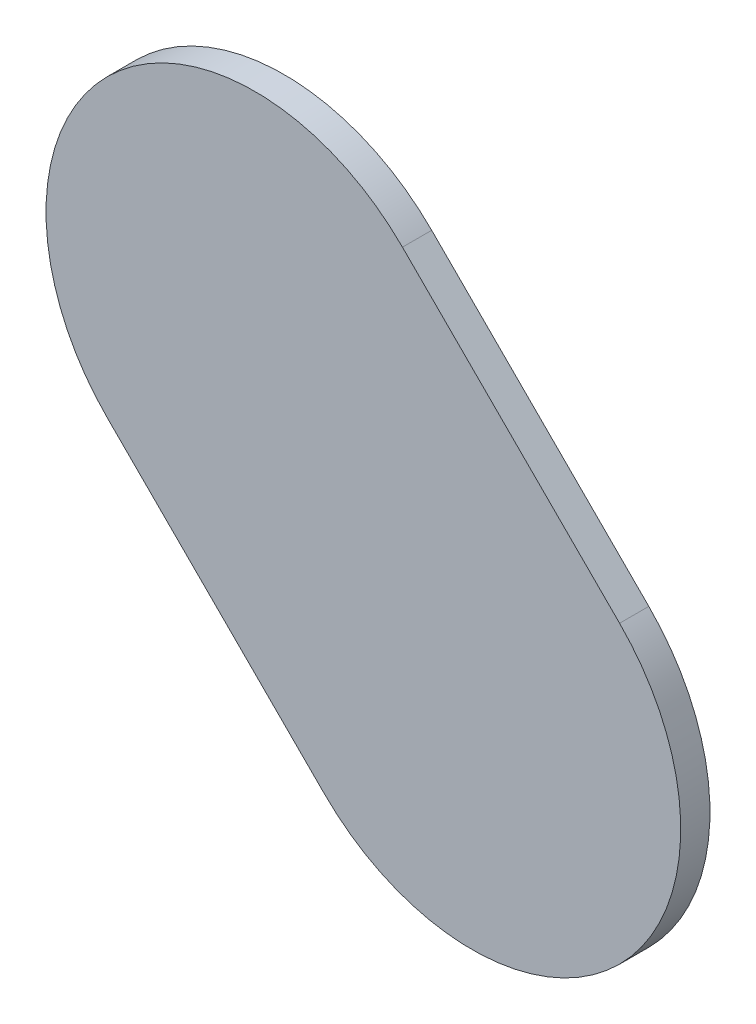
ISO-10303-21;
HEADER;
FILE_DESCRIPTION(('STEP AP214'),'2;1');
FILE_NAME('part.step','',(''),(''),'','','');
FILE_SCHEMA(('AUTOMOTIVE_DESIGN { 1 0 10303 214 1 1 1 1 }'));
ENDSEC;
DATA;
#1=APPLICATION_CONTEXT('core data for automotive mechanical design processes');
#2=APPLICATION_PROTOCOL_DEFINITION('international standard','automotive_design',2000,#1);
#3=PRODUCT_CONTEXT('',#1,'mechanical');
#4=PRODUCT('Part','Part','',(#3));
#5=PRODUCT_RELATED_PRODUCT_CATEGORY('part','',(#4));
#6=PRODUCT_DEFINITION_FORMATION('','',#4);
#7=PRODUCT_DEFINITION_CONTEXT('part definition',#1,'design');
#8=PRODUCT_DEFINITION('design','',#6,#7);
#9=PRODUCT_DEFINITION_SHAPE('','',#8);
#10=(LENGTH_UNIT() NAMED_UNIT(*) SI_UNIT(.MILLI.,.METRE.));
#11=(NAMED_UNIT(*) PLANE_ANGLE_UNIT() SI_UNIT($,.RADIAN.));
#12=(NAMED_UNIT(*) SI_UNIT($,.STERADIAN.) SOLID_ANGLE_UNIT());
#13=UNCERTAINTY_MEASURE_WITH_UNIT(LENGTH_MEASURE(1.E-05),#10,'distance_accuracy_value','');
#14=(GEOMETRIC_REPRESENTATION_CONTEXT(3) GLOBAL_UNCERTAINTY_ASSIGNED_CONTEXT((#13)) GLOBAL_UNIT_ASSIGNED_CONTEXT((#10,
#11,#12)) REPRESENTATION_CONTEXT('',''));
#15=CARTESIAN_POINT('',(0.,0.,0.));
#16=DIRECTION('',(0.,0.,1.));
#17=DIRECTION('',(1.,0.,0.));
#18=AXIS2_PLACEMENT_3D('',#15,#16,#17);
#19=CARTESIAN_POINT('',(97.116776,-106.953224,1.635));
#20=DIRECTION('',(0.,0.,1.));
#21=DIRECTION('',(1.,0.,0.));
#22=AXIS2_PLACEMENT_3D('',#19,#20,#21);
#23=PLANE('',#22);
#24=DIRECTION('',(-0.707106781186548,0.707106781186548,0.));
#25=VECTOR('',#24,1.);
#26=CARTESIAN_POINT('',(97.116776,-106.953224,1.635));
#27=LINE('',#26,#25);
#28=CARTESIAN_POINT('',(97.116776,-106.953224,1.635));
#29=VERTEX_POINT('',#28);
#30=CARTESIAN_POINT('',(96.856776,-106.693224,1.635));
#31=VERTEX_POINT('',#30);
#32=EDGE_CURVE('E83',#29,#31,#27,.T.);
#33=ORIENTED_EDGE('',*,*,#32,.T.);
#34=CARTESIAN_POINT('',(96.6799995,-106.8700005,1.635));
#35=DIRECTION('',(0.,0.,1.));
#36=DIRECTION('',(0.707106781186548,0.707106781186548,0.));
#37=AXIS2_PLACEMENT_3D('',#34,#35,#36);
#38=CIRCLE('',#37,0.249999723809);
#39=CARTESIAN_POINT('',(96.503223,-107.046777,1.635));
#40=VERTEX_POINT('',#39);
#41=EDGE_CURVE('E106',#31,#40,#38,.T.);
#42=ORIENTED_EDGE('',*,*,#41,.T.);
#43=DIRECTION('',(0.707106781186548,-0.707106781186548,0.));
#44=VECTOR('',#43,1.);
#45=CARTESIAN_POINT('',(96.503223,-107.046777,1.635));
#46=LINE('',#45,#44);
#47=CARTESIAN_POINT('',(96.763223,-107.306777,1.635));
#48=VERTEX_POINT('',#47);
#49=EDGE_CURVE('E76',#40,#48,#46,.T.);
#50=ORIENTED_EDGE('',*,*,#49,.T.);
#51=CARTESIAN_POINT('',(96.9399995,-107.1300005,1.635));
#52=DIRECTION('',(0.,0.,1.));
#53=DIRECTION('',(-0.707106781186548,-0.707106781186548,0.));
#54=AXIS2_PLACEMENT_3D('',#51,#52,#53);
#55=CIRCLE('',#54,0.249999723809);
#56=EDGE_CURVE('E11',#48,#29,#55,.T.);
#57=ORIENTED_EDGE('',*,*,#56,.T.);
#58=EDGE_LOOP('',(#33,#42,#50,#57));
#59=FACE_BOUND('',#58,.T.);
#60=ADVANCED_FACE('F17',(#59),#23,.T.);
#61=CARTESIAN_POINT('',(97.116776,-106.953224,1.6));
#62=DIRECTION('',(0.,0.,1.));
#63=DIRECTION('',(1.,0.,0.));
#64=AXIS2_PLACEMENT_3D('',#61,#62,#63);
#65=PLANE('',#64);
#66=CARTESIAN_POINT('',(96.9399995,-107.1300005,1.6));
#67=DIRECTION('',(0.,0.,1.));
#68=DIRECTION('',(-0.707106781186548,-0.707106781186548,0.));
#69=AXIS2_PLACEMENT_3D('',#66,#67,#68);
#70=CIRCLE('',#69,0.249999723809);
#71=CARTESIAN_POINT('',(96.763223,-107.306777,1.6));
#72=VERTEX_POINT('',#71);
#73=CARTESIAN_POINT('',(97.116776,-106.953224,1.6));
#74=VERTEX_POINT('',#73);
#75=EDGE_CURVE('E21',#72,#74,#70,.T.);
#76=ORIENTED_EDGE('',*,*,#75,.F.);
#77=DIRECTION('',(0.707106781186548,-0.707106781186548,0.));
#78=VECTOR('',#77,1.);
#79=CARTESIAN_POINT('',(96.503223,-107.046777,1.6));
#80=LINE('',#79,#78);
#81=CARTESIAN_POINT('',(96.503223,-107.046777,1.6));
#82=VERTEX_POINT('',#81);
#83=EDGE_CURVE('E100',#82,#72,#80,.T.);
#84=ORIENTED_EDGE('',*,*,#83,.F.);
#85=CARTESIAN_POINT('',(96.6799995,-106.8700005,1.6));
#86=DIRECTION('',(0.,0.,1.));
#87=DIRECTION('',(0.707106781186548,0.707106781186548,0.));
#88=AXIS2_PLACEMENT_3D('',#85,#86,#87);
#89=CIRCLE('',#88,0.249999723809);
#90=CARTESIAN_POINT('',(96.856776,-106.693224,1.6));
#91=VERTEX_POINT('',#90);
#92=EDGE_CURVE('E85',#91,#82,#89,.T.);
#93=ORIENTED_EDGE('',*,*,#92,.F.);
#94=DIRECTION('',(-0.707106781186548,0.707106781186548,0.));
#95=VECTOR('',#94,1.);
#96=CARTESIAN_POINT('',(97.116776,-106.953224,1.6));
#97=LINE('',#96,#95);
#98=EDGE_CURVE('E81',#74,#91,#97,.T.);
#99=ORIENTED_EDGE('',*,*,#98,.F.);
#100=EDGE_LOOP('',(#76,#84,#93,#99));
#101=FACE_BOUND('',#100,.T.);
#102=ADVANCED_FACE('F19',(#101),#65,.F.);
#103=CARTESIAN_POINT('',(96.9399995,-107.1300005,1.6));
#104=DIRECTION('',(0.,0.,-1.));
#105=DIRECTION('',(-0.707106781186548,-0.707106781186548,0.));
#106=AXIS2_PLACEMENT_3D('',#103,#104,#105);
#107=CYLINDRICAL_SURFACE('',#106,0.249999723809);
#108=ORIENTED_EDGE('',*,*,#75,.T.);
#109=DIRECTION('',(0.,0.,1.));
#110=VECTOR('',#109,1.);
#111=CARTESIAN_POINT('',(97.116776,-106.953224,1.6));
#112=LINE('',#111,#110);
#113=EDGE_CURVE('E70',#74,#29,#112,.T.);
#114=ORIENTED_EDGE('',*,*,#113,.T.);
#115=ORIENTED_EDGE('',*,*,#56,.F.);
#116=DIRECTION('',(0.,0.,1.));
#117=VECTOR('',#116,1.);
#118=CARTESIAN_POINT('',(96.763223,-107.306777,1.6));
#119=LINE('',#118,#117);
#120=EDGE_CURVE('E73',#72,#48,#119,.T.);
#121=ORIENTED_EDGE('',*,*,#120,.F.);
#122=EDGE_LOOP('',(#108,#114,#115,#121));
#123=FACE_BOUND('',#122,.T.);
#124=ADVANCED_FACE('F69',(#123),#107,.T.);
#125=CARTESIAN_POINT('',(96.503223,-107.046777,1.6));
#126=DIRECTION('',(0.707106781186548,0.707106781186548,0.));
#127=DIRECTION('',(0.,0.,-1.));
#128=AXIS2_PLACEMENT_3D('',#125,#126,#127);
#129=PLANE('',#128);
#130=ORIENTED_EDGE('',*,*,#83,.T.);
#131=ORIENTED_EDGE('',*,*,#120,.T.);
#132=ORIENTED_EDGE('',*,*,#49,.F.);
#133=DIRECTION('',(0.,0.,1.));
#134=VECTOR('',#133,1.);
#135=CARTESIAN_POINT('',(96.503223,-107.046777,1.6));
#136=LINE('',#135,#134);
#137=EDGE_CURVE('E102',#82,#40,#136,.T.);
#138=ORIENTED_EDGE('',*,*,#137,.F.);
#139=EDGE_LOOP('',(#130,#131,#132,#138));
#140=FACE_BOUND('',#139,.T.);
#141=ADVANCED_FACE('F120',(#140),#129,.F.);
#142=CARTESIAN_POINT('',(96.6799995,-106.8700005,1.6));
#143=DIRECTION('',(0.,0.,-1.));
#144=DIRECTION('',(0.707106781186548,0.707106781186548,0.));
#145=AXIS2_PLACEMENT_3D('',#142,#143,#144);
#146=CYLINDRICAL_SURFACE('',#145,0.249999723809);
#147=ORIENTED_EDGE('',*,*,#92,.T.);
#148=ORIENTED_EDGE('',*,*,#137,.T.);
#149=ORIENTED_EDGE('',*,*,#41,.F.);
#150=DIRECTION('',(0.,0.,1.));
#151=VECTOR('',#150,1.);
#152=CARTESIAN_POINT('',(96.856776,-106.693224,1.6));
#153=LINE('',#152,#151);
#154=EDGE_CURVE('E90',#91,#31,#153,.T.);
#155=ORIENTED_EDGE('',*,*,#154,.F.);
#156=EDGE_LOOP('',(#147,#148,#149,#155));
#157=FACE_BOUND('',#156,.T.);
#158=ADVANCED_FACE('F122',(#157),#146,.T.);
#159=CARTESIAN_POINT('',(97.116776,-106.953224,1.6));
#160=DIRECTION('',(-0.707106781186548,-0.707106781186548,0.));
#161=DIRECTION('',(-0.707106781186548,0.707106781186548,0.));
#162=AXIS2_PLACEMENT_3D('',#159,#160,#161);
#163=PLANE('',#162);
#164=ORIENTED_EDGE('',*,*,#98,.T.);
#165=ORIENTED_EDGE('',*,*,#154,.T.);
#166=ORIENTED_EDGE('',*,*,#32,.F.);
#167=ORIENTED_EDGE('',*,*,#113,.F.);
#168=EDGE_LOOP('',(#164,#165,#166,#167));
#169=FACE_BOUND('',#168,.T.);
#170=ADVANCED_FACE('F79',(#169),#163,.F.);
#171=CLOSED_SHELL('',(#60,#102,#124,#141,#158,#170));
#172=MANIFOLD_SOLID_BREP('B1',#171);
#173=ADVANCED_BREP_SHAPE_REPRESENTATION('',(#18,#172),#14);
#174=SHAPE_DEFINITION_REPRESENTATION(#9,#173);
ENDSEC;
END-ISO-10303-21;
